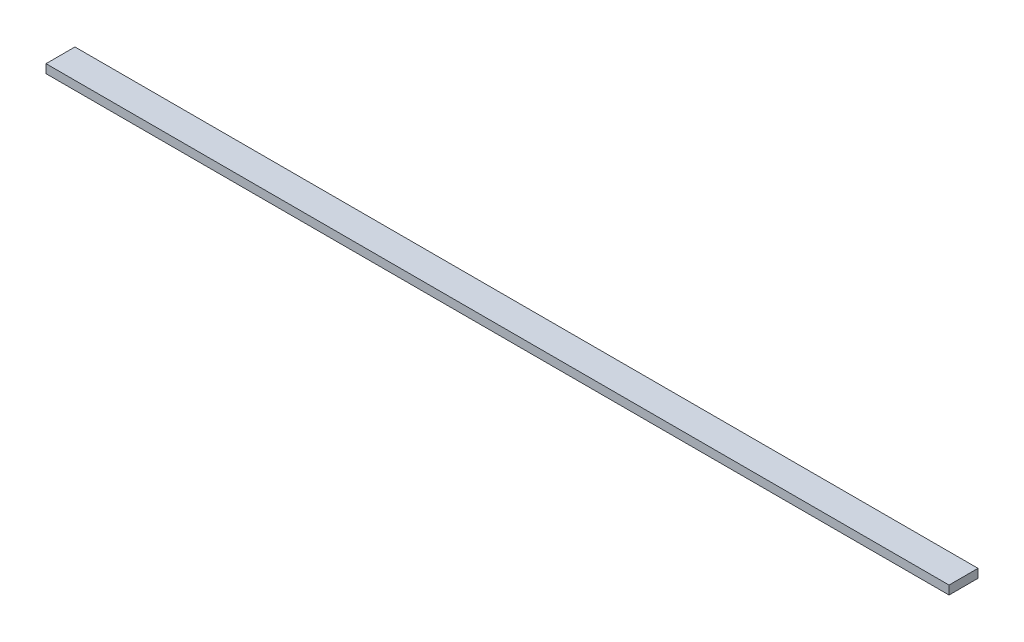
ISO-10303-21;
HEADER;
FILE_DESCRIPTION(('STEP AP214'),'2;1');
FILE_NAME('part.step','',(''),(''),'','','');
FILE_SCHEMA(('AUTOMOTIVE_DESIGN { 1 0 10303 214 1 1 1 1 }'));
ENDSEC;
DATA;
#1=APPLICATION_CONTEXT('core data for automotive mechanical design processes');
#2=APPLICATION_PROTOCOL_DEFINITION('international standard','automotive_design',2000,#1);
#3=PRODUCT_CONTEXT('',#1,'mechanical');
#4=PRODUCT('Part','Part','',(#3));
#5=PRODUCT_RELATED_PRODUCT_CATEGORY('part','',(#4));
#6=PRODUCT_DEFINITION_FORMATION('','',#4);
#7=PRODUCT_DEFINITION_CONTEXT('part definition',#1,'design');
#8=PRODUCT_DEFINITION('design','',#6,#7);
#9=PRODUCT_DEFINITION_SHAPE('','',#8);
#10=(LENGTH_UNIT() NAMED_UNIT(*) SI_UNIT(.MILLI.,.METRE.));
#11=(NAMED_UNIT(*) PLANE_ANGLE_UNIT() SI_UNIT($,.RADIAN.));
#12=(NAMED_UNIT(*) SI_UNIT($,.STERADIAN.) SOLID_ANGLE_UNIT());
#13=UNCERTAINTY_MEASURE_WITH_UNIT(LENGTH_MEASURE(1.E-05),#10,'distance_accuracy_value','');
#14=(GEOMETRIC_REPRESENTATION_CONTEXT(3) GLOBAL_UNCERTAINTY_ASSIGNED_CONTEXT((#13)) GLOBAL_UNIT_ASSIGNED_CONTEXT((#10,
#11,#12)) REPRESENTATION_CONTEXT('',''));
#15=CARTESIAN_POINT('',(0.,0.,0.));
#16=DIRECTION('',(0.,0.,1.));
#17=DIRECTION('',(1.,0.,0.));
#18=AXIS2_PLACEMENT_3D('',#15,#16,#17);
#19=CARTESIAN_POINT('',(-407.499582985822,18.,-218.58215179316));
#20=DIRECTION('',(1.,0.,0.));
#21=DIRECTION('',(0.,0.,-1.));
#22=AXIS2_PLACEMENT_3D('',#19,#20,#21);
#23=PLANE('',#22);
#24=DIRECTION('',(0.,0.,1.));
#25=VECTOR('',#24,1.);
#26=CARTESIAN_POINT('',(-407.499582985822,0.,-218.58215179316));
#27=LINE('',#26,#25);
#28=CARTESIAN_POINT('',(-407.499582985822,0.,-218.58215179316));
#29=VERTEX_POINT('',#28);
#30=CARTESIAN_POINT('',(-407.499582985822,0.,-158.58215179316));
#31=VERTEX_POINT('',#30);
#32=EDGE_CURVE('E98',#29,#31,#27,.T.);
#33=ORIENTED_EDGE('',*,*,#32,.T.);
#34=DIRECTION('',(0.,-1.,0.));
#35=VECTOR('',#34,1.);
#36=CARTESIAN_POINT('',(-407.499582985822,18.,-158.58215179316));
#37=LINE('',#36,#35);
#38=CARTESIAN_POINT('',(-407.499582985822,18.,-158.58215179316));
#39=VERTEX_POINT('',#38);
#40=EDGE_CURVE('E11',#39,#31,#37,.T.);
#41=ORIENTED_EDGE('',*,*,#40,.F.);
#42=DIRECTION('',(0.,0.,1.));
#43=VECTOR('',#42,1.);
#44=CARTESIAN_POINT('',(-407.499582985822,18.,-218.58215179316));
#45=LINE('',#44,#43);
#46=CARTESIAN_POINT('',(-407.499582985822,18.,-218.58215179316));
#47=VERTEX_POINT('',#46);
#48=EDGE_CURVE('E86',#47,#39,#45,.T.);
#49=ORIENTED_EDGE('',*,*,#48,.F.);
#50=DIRECTION('',(0.,-1.,0.));
#51=VECTOR('',#50,1.);
#52=CARTESIAN_POINT('',(-407.499582985822,18.,-218.58215179316));
#53=LINE('',#52,#51);
#54=EDGE_CURVE('E94',#47,#29,#53,.T.);
#55=ORIENTED_EDGE('',*,*,#54,.T.);
#56=EDGE_LOOP('',(#33,#41,#49,#55));
#57=FACE_BOUND('',#56,.T.);
#58=ADVANCED_FACE('F35',(#57),#23,.F.);
#59=CARTESIAN_POINT('',(-407.499582985822,18.,-158.58215179316));
#60=DIRECTION('',(0.,0.,-1.));
#61=DIRECTION('',(-1.,0.,0.));
#62=AXIS2_PLACEMENT_3D('',#59,#60,#61);
#63=PLANE('',#62);
#64=DIRECTION('',(1.,0.,0.));
#65=VECTOR('',#64,1.);
#66=CARTESIAN_POINT('',(-407.499582985822,0.,-158.58215179316));
#67=LINE('',#66,#65);
#68=CARTESIAN_POINT('',(1464.50041701418,0.,-158.58215179316));
#69=VERTEX_POINT('',#68);
#70=EDGE_CURVE('E90',#31,#69,#67,.T.);
#71=ORIENTED_EDGE('',*,*,#70,.T.);
#72=DIRECTION('',(0.,-1.,0.));
#73=VECTOR('',#72,1.);
#74=CARTESIAN_POINT('',(1464.50041701418,18.,-158.58215179316));
#75=LINE('',#74,#73);
#76=CARTESIAN_POINT('',(1464.50041701418,18.,-158.58215179316));
#77=VERTEX_POINT('',#76);
#78=EDGE_CURVE('E43',#77,#69,#75,.T.);
#79=ORIENTED_EDGE('',*,*,#78,.F.);
#80=DIRECTION('',(1.,0.,0.));
#81=VECTOR('',#80,1.);
#82=CARTESIAN_POINT('',(-407.499582985822,18.,-158.58215179316));
#83=LINE('',#82,#81);
#84=EDGE_CURVE('E81',#39,#77,#83,.T.);
#85=ORIENTED_EDGE('',*,*,#84,.F.);
#86=ORIENTED_EDGE('',*,*,#40,.T.);
#87=EDGE_LOOP('',(#71,#79,#85,#86));
#88=FACE_BOUND('',#87,.T.);
#89=ADVANCED_FACE('F89',(#88),#63,.F.);
#90=CARTESIAN_POINT('',(1464.50041701418,18.,-218.58215179316));
#91=DIRECTION('',(-1.,0.,0.));
#92=DIRECTION('',(0.,0.,1.));
#93=AXIS2_PLACEMENT_3D('',#90,#91,#92);
#94=PLANE('',#93);
#95=DIRECTION('',(0.,0.,-1.));
#96=VECTOR('',#95,1.);
#97=CARTESIAN_POINT('',(1464.50041701418,0.,-218.58215179316));
#98=LINE('',#97,#96);
#99=CARTESIAN_POINT('',(1464.50041701418,0.,-218.58215179316));
#100=VERTEX_POINT('',#99);
#101=EDGE_CURVE('E68',#69,#100,#98,.T.);
#102=ORIENTED_EDGE('',*,*,#101,.T.);
#103=DIRECTION('',(0.,-1.,0.));
#104=VECTOR('',#103,1.);
#105=CARTESIAN_POINT('',(1464.50041701418,18.,-218.58215179316));
#106=LINE('',#105,#104);
#107=CARTESIAN_POINT('',(1464.50041701418,18.,-218.58215179316));
#108=VERTEX_POINT('',#107);
#109=EDGE_CURVE('E91',#108,#100,#106,.T.);
#110=ORIENTED_EDGE('',*,*,#109,.F.);
#111=DIRECTION('',(0.,0.,-1.));
#112=VECTOR('',#111,1.);
#113=CARTESIAN_POINT('',(1464.50041701418,18.,-218.58215179316));
#114=LINE('',#113,#112);
#115=EDGE_CURVE('E84',#77,#108,#114,.T.);
#116=ORIENTED_EDGE('',*,*,#115,.F.);
#117=ORIENTED_EDGE('',*,*,#78,.T.);
#118=EDGE_LOOP('',(#102,#110,#116,#117));
#119=FACE_BOUND('',#118,.T.);
#120=ADVANCED_FACE('F92',(#119),#94,.F.);
#121=CARTESIAN_POINT('',(-407.499582985822,18.,-218.58215179316));
#122=DIRECTION('',(0.,0.,1.));
#123=DIRECTION('',(1.,0.,0.));
#124=AXIS2_PLACEMENT_3D('',#121,#122,#123);
#125=PLANE('',#124);
#126=DIRECTION('',(-1.,0.,0.));
#127=VECTOR('',#126,1.);
#128=CARTESIAN_POINT('',(-407.499582985822,0.,-218.58215179316));
#129=LINE('',#128,#127);
#130=EDGE_CURVE('E74',#100,#29,#129,.T.);
#131=ORIENTED_EDGE('',*,*,#130,.T.);
#132=ORIENTED_EDGE('',*,*,#54,.F.);
#133=DIRECTION('',(-1.,0.,0.));
#134=VECTOR('',#133,1.);
#135=CARTESIAN_POINT('',(-407.499582985822,18.,-218.58215179316));
#136=LINE('',#135,#134);
#137=EDGE_CURVE('E51',#108,#47,#136,.T.);
#138=ORIENTED_EDGE('',*,*,#137,.F.);
#139=ORIENTED_EDGE('',*,*,#109,.T.);
#140=EDGE_LOOP('',(#131,#132,#138,#139));
#141=FACE_BOUND('',#140,.T.);
#142=ADVANCED_FACE('F105',(#141),#125,.F.);
#143=CARTESIAN_POINT('',(0.,18.,0.));
#144=DIRECTION('',(0.,1.,0.));
#145=DIRECTION('',(0.,0.,1.));
#146=AXIS2_PLACEMENT_3D('',#143,#144,#145);
#147=PLANE('',#146);
#148=ORIENTED_EDGE('',*,*,#48,.T.);
#149=ORIENTED_EDGE('',*,*,#84,.T.);
#150=ORIENTED_EDGE('',*,*,#115,.T.);
#151=ORIENTED_EDGE('',*,*,#137,.T.);
#152=EDGE_LOOP('',(#148,#149,#150,#151));
#153=FACE_BOUND('',#152,.T.);
#154=ADVANCED_FACE('F82',(#153),#147,.T.);
#155=CARTESIAN_POINT('',(0.,0.,0.));
#156=DIRECTION('',(0.,1.,0.));
#157=DIRECTION('',(0.,0.,1.));
#158=AXIS2_PLACEMENT_3D('',#155,#156,#157);
#159=PLANE('',#158);
#160=ORIENTED_EDGE('',*,*,#32,.F.);
#161=ORIENTED_EDGE('',*,*,#130,.F.);
#162=ORIENTED_EDGE('',*,*,#101,.F.);
#163=ORIENTED_EDGE('',*,*,#70,.F.);
#164=EDGE_LOOP('',(#160,#161,#162,#163));
#165=FACE_BOUND('',#164,.T.);
#166=ADVANCED_FACE('F108',(#165),#159,.F.);
#167=CLOSED_SHELL('',(#58,#89,#120,#142,#154,#166));
#168=MANIFOLD_SOLID_BREP('B2',#167);
#169=ADVANCED_BREP_SHAPE_REPRESENTATION('',(#18,#168),#14);
#170=SHAPE_DEFINITION_REPRESENTATION(#9,#169);
ENDSEC;
END-ISO-10303-21;
